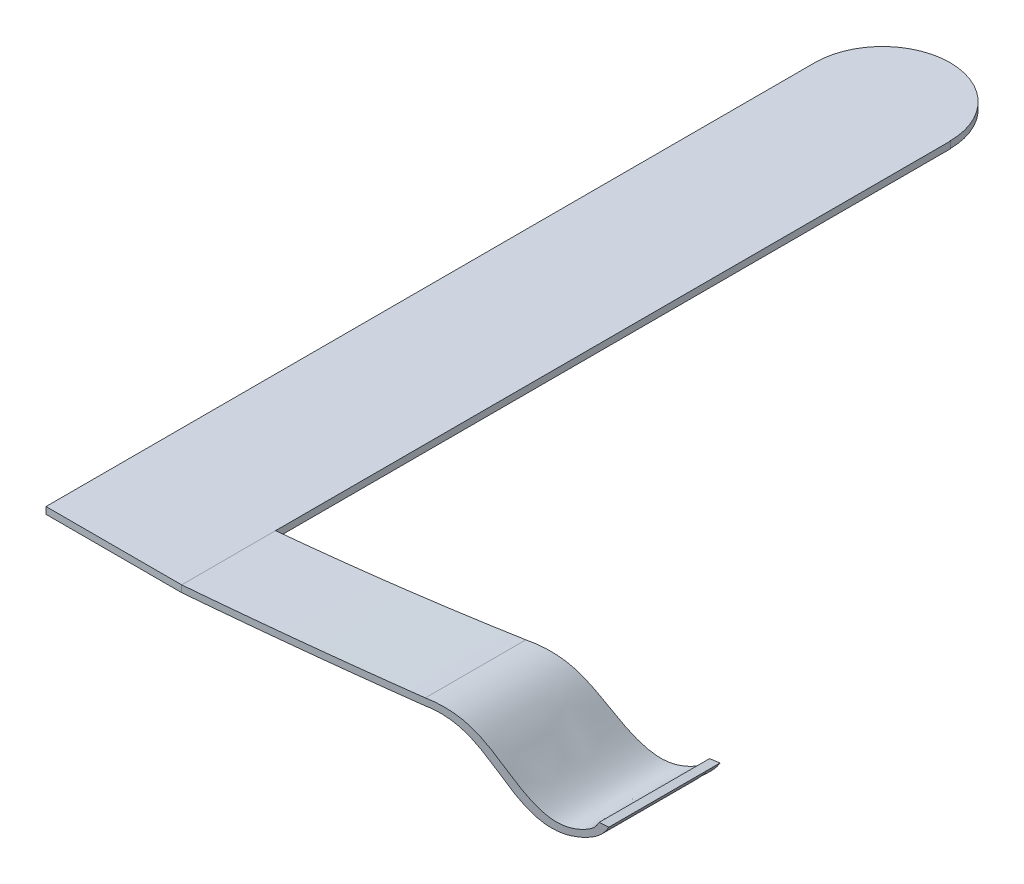
ISO-10303-21;
HEADER;
FILE_DESCRIPTION(('STEP AP214'),'2;1');
FILE_NAME('part.step','',(''),(''),'','','');
FILE_SCHEMA(('AUTOMOTIVE_DESIGN { 1 0 10303 214 1 1 1 1 }'));
ENDSEC;
DATA;
#1=APPLICATION_CONTEXT('core data for automotive mechanical design processes');
#2=APPLICATION_PROTOCOL_DEFINITION('international standard','automotive_design',2000,#1);
#3=PRODUCT_CONTEXT('',#1,'mechanical');
#4=PRODUCT('Part','Part','',(#3));
#5=PRODUCT_RELATED_PRODUCT_CATEGORY('part','',(#4));
#6=PRODUCT_DEFINITION_FORMATION('','',#4);
#7=PRODUCT_DEFINITION_CONTEXT('part definition',#1,'design');
#8=PRODUCT_DEFINITION('design','',#6,#7);
#9=PRODUCT_DEFINITION_SHAPE('','',#8);
#10=(LENGTH_UNIT() NAMED_UNIT(*) SI_UNIT(.MILLI.,.METRE.));
#11=(NAMED_UNIT(*) PLANE_ANGLE_UNIT() SI_UNIT($,.RADIAN.));
#12=(NAMED_UNIT(*) SI_UNIT($,.STERADIAN.) SOLID_ANGLE_UNIT());
#13=UNCERTAINTY_MEASURE_WITH_UNIT(LENGTH_MEASURE(1.E-05),#10,'distance_accuracy_value','');
#14=(GEOMETRIC_REPRESENTATION_CONTEXT(3) GLOBAL_UNCERTAINTY_ASSIGNED_CONTEXT((#13)) GLOBAL_UNIT_ASSIGNED_CONTEXT((#10,
#11,#12)) REPRESENTATION_CONTEXT('',''));
#15=CARTESIAN_POINT('',(0.,0.,0.));
#16=DIRECTION('',(0.,0.,1.));
#17=DIRECTION('',(1.,0.,0.));
#18=AXIS2_PLACEMENT_3D('',#15,#16,#17);
#19=CARTESIAN_POINT('',(0.00353824485749026,30.6,17.));
#20=DIRECTION('',(0.,-1.,0.));
#21=DIRECTION('',(0.,0.,-1.));
#22=AXIS2_PLACEMENT_3D('',#19,#20,#21);
#23=PLANE('',#22);
#24=DIRECTION('',(-1.,0.,0.));
#25=VECTOR('',#24,1.);
#26=CARTESIAN_POINT('',(1.50353824485749,30.6,17.));
#27=LINE('',#26,#25);
#28=CARTESIAN_POINT('',(1.5035388442671,30.5999999999988,17.));
#29=VERTEX_POINT('',#28);
#30=CARTESIAN_POINT('',(-1.49646175514251,30.6,17.));
#31=VERTEX_POINT('',#30);
#32=EDGE_CURVE('E296',#29,#31,#27,.T.);
#33=ORIENTED_EDGE('',*,*,#32,.F.);
#34=DIRECTION('',(0.,0.,1.));
#35=VECTOR('',#34,1.);
#36=CARTESIAN_POINT('',(1.5035388442671,30.5999999999988,-3.));
#37=LINE('',#36,#35);
#38=CARTESIAN_POINT('',(1.5035388442671,30.5999999999988,14.9244554655699));
#39=VERTEX_POINT('',#38);
#40=EDGE_CURVE('E323',#39,#29,#37,.T.);
#41=ORIENTED_EDGE('',*,*,#40,.F.);
#42=DIRECTION('',(0.,0.,-1.));
#43=VECTOR('',#42,1.);
#44=CARTESIAN_POINT('',(1.50353824485749,30.6,17.));
#45=LINE('',#44,#43);
#46=CARTESIAN_POINT('',(1.50353824485749,30.6,0.));
#47=VERTEX_POINT('',#46);
#48=EDGE_CURVE('E305',#39,#47,#45,.T.);
#49=ORIENTED_EDGE('',*,*,#48,.T.);
#50=DIRECTION('',(-1.,0.,0.));
#51=VECTOR('',#50,1.);
#52=CARTESIAN_POINT('',(0.00353824485749026,30.6,0.));
#53=LINE('',#52,#51);
#54=CARTESIAN_POINT('',(1.49646175514251,30.6,0.));
#55=VERTEX_POINT('',#54);
#56=EDGE_CURVE('E152',#47,#55,#53,.T.);
#57=ORIENTED_EDGE('',*,*,#56,.T.);
#58=CARTESIAN_POINT('',(0.,30.6,0.));
#59=DIRECTION('',(0.,1.,0.));
#60=DIRECTION('',(0.,0.,1.));
#61=AXIS2_PLACEMENT_3D('',#58,#59,#60);
#62=CIRCLE('',#61,1.49646175514251);
#63=CARTESIAN_POINT('',(-1.49646175514251,30.6,0.));
#64=VERTEX_POINT('',#63);
#65=EDGE_CURVE('E141',#55,#64,#62,.T.);
#66=ORIENTED_EDGE('',*,*,#65,.T.);
#67=DIRECTION('',(0.,0.,-1.));
#68=VECTOR('',#67,1.);
#69=CARTESIAN_POINT('',(-1.49646175514251,30.6,17.));
#70=LINE('',#69,#68);
#71=EDGE_CURVE('E150',#31,#64,#70,.T.);
#72=ORIENTED_EDGE('',*,*,#71,.F.);
#73=EDGE_LOOP('',(#33,#41,#49,#57,#66,#72));
#74=FACE_BOUND('',#73,.T.);
#75=ADVANCED_FACE('F36',(#74),#23,.F.);
#76=CARTESIAN_POINT('',(-1.49646175514251,30.6,17.));
#77=DIRECTION('',(1.,0.,0.));
#78=DIRECTION('',(0.,0.,-1.));
#79=AXIS2_PLACEMENT_3D('',#76,#77,#78);
#80=PLANE('',#79);
#81=DIRECTION('',(0.,-1.,0.));
#82=VECTOR('',#81,1.);
#83=CARTESIAN_POINT('',(-1.49646175514251,30.6,0.));
#84=LINE('',#83,#82);
#85=CARTESIAN_POINT('',(-1.49646175514251,30.45,0.));
#86=VERTEX_POINT('',#85);
#87=EDGE_CURVE('E134',#64,#86,#84,.T.);
#88=ORIENTED_EDGE('',*,*,#87,.T.);
#89=DIRECTION('',(0.,0.,-1.));
#90=VECTOR('',#89,1.);
#91=CARTESIAN_POINT('',(-1.49646175514251,30.45,17.));
#92=LINE('',#91,#90);
#93=CARTESIAN_POINT('',(-1.49646175514251,30.45,17.));
#94=VERTEX_POINT('',#93);
#95=EDGE_CURVE('E147',#94,#86,#92,.T.);
#96=ORIENTED_EDGE('',*,*,#95,.F.);
#97=DIRECTION('',(0.,-1.,0.));
#98=VECTOR('',#97,1.);
#99=CARTESIAN_POINT('',(-1.49646175514251,30.6,17.));
#100=LINE('',#99,#98);
#101=EDGE_CURVE('E298',#31,#94,#100,.T.);
#102=ORIENTED_EDGE('',*,*,#101,.F.);
#103=ORIENTED_EDGE('',*,*,#71,.T.);
#104=EDGE_LOOP('',(#88,#96,#102,#103));
#105=FACE_BOUND('',#104,.T.);
#106=ADVANCED_FACE('F145',(#105),#80,.F.);
#107=CARTESIAN_POINT('',(-1.49646175514251,30.45,17.));
#108=DIRECTION('',(0.,1.,0.));
#109=DIRECTION('',(0.,0.,1.));
#110=AXIS2_PLACEMENT_3D('',#107,#108,#109);
#111=PLANE('',#110);
#112=ORIENTED_EDGE('',*,*,#95,.T.);
#113=CARTESIAN_POINT('',(0.,30.45,0.));
#114=DIRECTION('',(0.,1.,0.));
#115=DIRECTION('',(0.,0.,1.));
#116=AXIS2_PLACEMENT_3D('',#113,#114,#115);
#117=CIRCLE('',#116,1.49646175514251);
#118=CARTESIAN_POINT('',(1.49646175514251,30.45,0.));
#119=VERTEX_POINT('',#118);
#120=EDGE_CURVE('E131',#119,#86,#117,.T.);
#121=ORIENTED_EDGE('',*,*,#120,.F.);
#122=DIRECTION('',(1.,0.,0.));
#123=VECTOR('',#122,1.);
#124=CARTESIAN_POINT('',(-1.49646175514251,30.45,0.));
#125=LINE('',#124,#123);
#126=CARTESIAN_POINT('',(1.50353824485749,30.45,0.));
#127=VERTEX_POINT('',#126);
#128=EDGE_CURVE('E151',#119,#127,#125,.T.);
#129=ORIENTED_EDGE('',*,*,#128,.T.);
#130=DIRECTION('',(0.,0.,-1.));
#131=VECTOR('',#130,1.);
#132=CARTESIAN_POINT('',(1.50353824485749,30.45,17.));
#133=LINE('',#132,#131);
#134=CARTESIAN_POINT('',(1.50353824485749,30.45,14.9244555259564));
#135=VERTEX_POINT('',#134);
#136=EDGE_CURVE('E162',#135,#127,#133,.T.);
#137=ORIENTED_EDGE('',*,*,#136,.F.);
#138=CARTESIAN_POINT('',(1.50353824485749,30.45,17.));
#139=VERTEX_POINT('',#138);
#140=EDGE_CURVE('E158',#139,#135,#133,.T.);
#141=ORIENTED_EDGE('',*,*,#140,.F.);
#142=DIRECTION('',(1.,0.,0.));
#143=VECTOR('',#142,1.);
#144=CARTESIAN_POINT('',(-1.49646175514251,30.45,17.));
#145=LINE('',#144,#143);
#146=EDGE_CURVE('E157',#94,#139,#145,.T.);
#147=ORIENTED_EDGE('',*,*,#146,.F.);
#148=EDGE_LOOP('',(#112,#121,#129,#137,#141,#147));
#149=FACE_BOUND('',#148,.T.);
#150=ADVANCED_FACE('F154',(#149),#111,.F.);
#151=CARTESIAN_POINT('',(1.50353824485749,30.45,17.));
#152=DIRECTION('',(-1.,0.,0.));
#153=DIRECTION('',(0.,0.,1.));
#154=AXIS2_PLACEMENT_3D('',#151,#152,#153);
#155=PLANE('',#154);
#156=ORIENTED_EDGE('',*,*,#48,.F.);
#157=DIRECTION('',(0.,-1.,0.));
#158=VECTOR('',#157,1.);
#159=CARTESIAN_POINT('',(1.50353824485749,30.6,14.9244555259564));
#160=LINE('',#159,#158);
#161=EDGE_CURVE('E293',#39,#135,#160,.T.);
#162=ORIENTED_EDGE('',*,*,#161,.T.);
#163=ORIENTED_EDGE('',*,*,#136,.T.);
#164=DIRECTION('',(0.,1.,0.));
#165=VECTOR('',#164,1.);
#166=CARTESIAN_POINT('',(1.50353824485749,30.45,0.));
#167=LINE('',#166,#165);
#168=EDGE_CURVE('E299',#127,#47,#167,.T.);
#169=ORIENTED_EDGE('',*,*,#168,.T.);
#170=EDGE_LOOP('',(#156,#162,#163,#169));
#171=FACE_BOUND('',#170,.T.);
#172=ADVANCED_FACE('F318',(#171),#155,.F.);
#173=CARTESIAN_POINT('',(0.,0.,17.));
#174=DIRECTION('',(0.,0.,1.));
#175=DIRECTION('',(1.,0.,0.));
#176=AXIS2_PLACEMENT_3D('',#173,#174,#175);
#177=PLANE('',#176);
#178=ORIENTED_EDGE('',*,*,#32,.T.);
#179=ORIENTED_EDGE('',*,*,#101,.T.);
#180=ORIENTED_EDGE('',*,*,#146,.T.);
#181=DIRECTION('',(0.,1.,0.));
#182=VECTOR('',#181,1.);
#183=CARTESIAN_POINT('',(1.50353824485749,30.45,17.));
#184=LINE('',#183,#182);
#185=EDGE_CURVE('E302',#139,#29,#184,.T.);
#186=ORIENTED_EDGE('',*,*,#185,.T.);
#187=EDGE_LOOP('',(#178,#179,#180,#186));
#188=FACE_BOUND('',#187,.T.);
#189=ADVANCED_FACE('F266',(#188),#177,.T.);
#190=CARTESIAN_POINT('',(0.,0.,0.));
#191=DIRECTION('',(0.,0.,1.));
#192=DIRECTION('',(1.,0.,0.));
#193=AXIS2_PLACEMENT_3D('',#190,#191,#192);
#194=PLANE('',#193);
#195=ORIENTED_EDGE('',*,*,#128,.F.);
#196=DIRECTION('',(0.,1.,0.));
#197=VECTOR('',#196,1.);
#198=CARTESIAN_POINT('',(1.49646175514251,30.45,0.));
#199=LINE('',#198,#197);
#200=EDGE_CURVE('E137',#119,#55,#199,.T.);
#201=ORIENTED_EDGE('',*,*,#200,.T.);
#202=ORIENTED_EDGE('',*,*,#56,.F.);
#203=ORIENTED_EDGE('',*,*,#168,.F.);
#204=EDGE_LOOP('',(#195,#201,#202,#203));
#205=FACE_BOUND('',#204,.T.);
#206=ADVANCED_FACE('F264',(#205),#194,.F.);
#207=CARTESIAN_POINT('',(0.,30.6,0.));
#208=DIRECTION('',(0.,-1.,0.));
#209=DIRECTION('',(0.,0.,-1.));
#210=AXIS2_PLACEMENT_3D('',#207,#208,#209);
#211=CYLINDRICAL_SURFACE('',#210,17.0663595196442);
#212=ORIENTED_EDGE('',*,*,#185,.F.);
#213=CARTESIAN_POINT('',(1.50353824485749,30.45,17.));
#214=CARTESIAN_POINT('',(1.68822974451204,30.4500039668715,16.98366812957));
#215=CARTESIAN_POINT('',(1.87264239920038,30.4476136351388,16.9643216783802));
#216=CARTESIAN_POINT('',(2.24063004913441,30.4380848180046,16.9196494404007));
#217=CARTESIAN_POINT('',(2.42420499474681,30.4309460548493,16.8943233038922));
#218=CARTESIAN_POINT('',(2.88587190987279,30.4069990661434,16.8229563805725));
#219=CARTESIAN_POINT('',(3.16321273164494,30.3870870383214,16.7730075168682));
#220=CARTESIAN_POINT('',(3.71420726952608,30.3366653497662,16.6596651725587));
#221=CARTESIAN_POINT('',(3.98786010199984,30.3061531945599,16.5962685287258));
#222=CARTESIAN_POINT('',(4.53461598958499,30.2344553771636,16.4553566590931));
#223=CARTESIAN_POINT('',(4.80764664330801,30.1931136288903,16.3776403545203));
#224=CARTESIAN_POINT('',(5.34791166757845,30.1006600879738,16.2092764117546));
#225=CARTESIAN_POINT('',(5.61514790172093,30.0495514900308,16.1186330044222));
#226=CARTESIAN_POINT('',(5.87910006647267,29.9938814388808,16.0217605044561));
#227=B_SPLINE_CURVE_WITH_KNOTS('',3,(#213,#214,#215,#216,#217,#218,#219,#220,#221,#222,#223,
#224,#225,#226),.UNSPECIFIED.,.F.,.F.,(4,2,2,2,2,2,4),(0.,0.556172772404506,1.11237808033915,
1.95931027013703,2.80644189925514,3.66652803374528,4.52633331730616),.UNSPECIFIED.);
#228=CARTESIAN_POINT('',(5.87910006647267,29.9938814388808,16.0217605044561));
#229=VERTEX_POINT('',#228);
#230=EDGE_CURVE('E281',#139,#229,#227,.T.);
#231=ORIENTED_EDGE('',*,*,#230,.T.);
#232=CARTESIAN_POINT('',(5.87910006647267,29.9938814388808,16.0217605044561));
#233=CARTESIAN_POINT('',(5.91323114055558,29.9894586919252,16.0092376166556));
#234=CARTESIAN_POINT('',(5.94717172147394,29.9836126949786,15.996658265575));
#235=CARTESIAN_POINT('',(6.01441881864245,29.9689813517303,15.9714955873555));
#236=CARTESIAN_POINT('',(6.04772518849224,29.9601953352478,15.9589122599643));
#237=CARTESIAN_POINT('',(6.11305553933172,29.9397120045094,15.9340010782126));
#238=CARTESIAN_POINT('',(6.14508988817875,29.9280494842928,15.9216719517461));
#239=CARTESIAN_POINT('',(6.20802701831235,29.9018274525662,15.8972377044968));
#240=CARTESIAN_POINT('',(6.23893006213451,29.8872686182984,15.8851325320689));
#241=CARTESIAN_POINT('',(6.2997264106735,29.8552683675535,15.8611208373726));
#242=CARTESIAN_POINT('',(6.32960658974609,29.8377996800138,15.8492174953272));
#243=CARTESIAN_POINT('',(6.38792781296583,29.8003661387717,15.8258014901629));
#244=CARTESIAN_POINT('',(6.41636825183317,29.7804002472654,15.8142889920173));
#245=CARTESIAN_POINT('',(6.49954681424749,29.7172177042852,15.7803712452834));
#246=CARTESIAN_POINT('',(6.55208879548047,29.6707453174196,15.7586069239808));
#247=CARTESIAN_POINT('',(6.63422450144673,29.5895362857381,15.7241505892769));
#248=CARTESIAN_POINT('',(6.6653502217644,29.5564798096249,15.7109776581865));
#249=CARTESIAN_POINT('',(6.72582417216138,29.4885643426081,15.6851838487002));
#250=CARTESIAN_POINT('',(6.75517221502784,29.4537051625702,15.6725630284876));
#251=CARTESIAN_POINT('',(6.84119369859012,29.3470575596067,15.6353011586714));
#252=CARTESIAN_POINT('',(6.89571602665537,29.273333419739,15.6113148477092));
#253=CARTESIAN_POINT('',(7.00253703885361,29.1237655719813,15.5636922998042));
#254=CARTESIAN_POINT('',(7.05482529337669,29.0479141907292,15.5400579827563));
#255=CARTESIAN_POINT('',(7.15988507153852,28.8968121556332,15.4919338684862));
#256=CARTESIAN_POINT('',(7.21265648642101,28.8215613734055,15.4674442604532));
#257=CARTESIAN_POINT('',(7.31492314730867,28.6829955726034,15.4193165276066));
#258=CARTESIAN_POINT('',(7.36405312886061,28.6193308938693,15.3959280701416));
#259=CARTESIAN_POINT('',(7.46690933405348,28.4968985638885,15.3463077207739));
#260=CARTESIAN_POINT('',(7.52063196877506,28.4381271584333,15.3200780449306));
#261=CARTESIAN_POINT('',(7.62192592529253,28.3418813542097,15.2698820827123));
#262=CARTESIAN_POINT('',(7.66814758227328,28.3025944582953,15.2467418208406));
#263=CARTESIAN_POINT('',(7.7651540836258,28.232614508725,15.1975632138027));
#264=CARTESIAN_POINT('',(7.81591262198168,28.2018756828376,15.171541390146));
#265=CARTESIAN_POINT('',(7.88788895527218,28.1680664066544,15.1341436998642));
#266=CARTESIAN_POINT('',(7.90736206998787,28.1598329173247,15.1239792378096));
#267=CARTESIAN_POINT('',(7.94676800561019,28.1450642870581,15.1033108915008));
#268=CARTESIAN_POINT('',(7.96670072494546,28.1385287747163,15.0928070820394));
#269=CARTESIAN_POINT('',(8.00715781290207,28.1272006383101,15.0713828205013));
#270=CARTESIAN_POINT('',(8.02768639319729,28.122429579353,15.060458906698));
#271=CARTESIAN_POINT('',(8.06898669865705,28.1147809054727,15.0383720406265));
#272=CARTESIAN_POINT('',(8.0897585959236,28.111904724875,15.0272089138705));
#273=CARTESIAN_POINT('',(8.11057713146547,28.11,15.0159637002858));
#274=B_SPLINE_CURVE_WITH_KNOTS('',3,(#232,#233,#234,#235,#236,#237,#238,#239,#240,#241,#242,
#243,#244,#245,#246,#247,#248,#249,#250,#251,#252,#253,#254,#255,#256,#257,#258,#259,#260,#261,
#262,#263,#264,#265,#266,#267,#268,#269,#270,#271,#272,#273),.UNSPECIFIED.,.F.,.F.,(4,2,2,2,2,2,
2,2,2,2,2,2,2,2,2,2,2,2,2,2,4),(0.,0.109864738679766,0.219754538232763,0.328375235040353,
0.436970562967198,0.546647701555483,0.656370572866329,0.876007545349609,1.01778017975357,
1.1595677188166,1.44372123020966,1.72908179268055,2.01437962863422,2.26548745629332,
2.51640081925497,2.71066420283717,2.90386640731285,2.97418667405305,3.04449154639705,
3.11562931468752,3.18682086893149),.UNSPECIFIED.);
#275=CARTESIAN_POINT('',(8.1105771314799,28.11,15.0159637002779));
#276=VERTEX_POINT('',#275);
#277=EDGE_CURVE('E241',#229,#276,#274,.T.);
#278=ORIENTED_EDGE('',*,*,#277,.T.);
#279=CARTESIAN_POINT('',(0.,28.11,0.));
#280=DIRECTION('',(0.,1.,0.));
#281=DIRECTION('',(0.,0.,1.));
#282=AXIS2_PLACEMENT_3D('',#279,#280,#281);
#283=CIRCLE('',#282,17.0663595196442);
#284=CARTESIAN_POINT('',(8.23891239219343,28.11,14.9459342246482));
#285=VERTEX_POINT('',#284);
#286=EDGE_CURVE('E287',#276,#285,#283,.T.);
#287=ORIENTED_EDGE('',*,*,#286,.T.);
#288=CARTESIAN_POINT('',(8.23891239220167,28.11,14.9459342246437));
#289=CARTESIAN_POINT('',(8.25913524529287,28.1118339453389,14.934786999038));
#290=CARTESIAN_POINT('',(8.27929495730358,28.1144553503247,14.9236199271016));
#291=CARTESIAN_POINT('',(8.31943537310482,28.1214685001042,14.9012800794827));
#292=CARTESIAN_POINT('',(8.33941464610469,28.1258691759318,14.8901075633382));
#293=CARTESIAN_POINT('',(8.37918547988215,28.1366900889781,14.8677639827306));
#294=CARTESIAN_POINT('',(8.39897136966234,28.1431354416003,14.8565947652477));
#295=CARTESIAN_POINT('',(8.43778845795454,28.1583628638801,14.8345828391142));
#296=CARTESIAN_POINT('',(8.45682106922755,28.167140295395,14.8237395294162));
#297=CARTESIAN_POINT('',(8.48538597379033,28.1829133431134,14.8073964456657));
#298=CARTESIAN_POINT('',(8.49533923087312,28.1889332857676,14.8016878944932));
#299=CARTESIAN_POINT('',(8.51476540259117,28.2019081608585,14.7905213737364));
#300=CARTESIAN_POINT('',(8.5242385140198,28.2088627058994,14.7850633015786));
#301=CARTESIAN_POINT('',(8.54248429756015,28.2237476398431,14.774528737118));
#302=CARTESIAN_POINT('',(8.55126157853918,28.2316705335534,14.7694497498838));
#303=CARTESIAN_POINT('',(8.56802038611188,28.2485564765028,14.7597340187716));
#304=CARTESIAN_POINT('',(8.57600205417466,28.2575193402077,14.7550971962779));
#305=CARTESIAN_POINT('',(8.59097150969852,28.2759972914412,14.7463862874275));
#306=CARTESIAN_POINT('',(8.59798132810547,28.2854889856902,14.7422998250152));
#307=CARTESIAN_POINT('',(8.61134148133633,28.3050828977435,14.734499822459));
#308=CARTESIAN_POINT('',(8.6176910904319,28.315185768485,14.7307866928423));
#309=CARTESIAN_POINT('',(8.62991102127479,28.3359811086178,14.7236311495084));
#310=CARTESIAN_POINT('',(8.63577296805354,28.3466800431931,14.7201934933612));
#311=CARTESIAN_POINT('',(8.64701723602024,28.3683650645749,14.7135910371284));
#312=CARTESIAN_POINT('',(8.6524010043717,28.3793501450877,14.7104254147726));
#313=CARTESIAN_POINT('',(8.65761609193715,28.3904303279046,14.7073556718528));
#314=B_SPLINE_CURVE_WITH_KNOTS('',3,(#288,#289,#290,#291,#292,#293,#294,#295,#296,#297,#298,
#299,#300,#301,#302,#303,#304,#305,#306,#307,#308,#309,#310,#311,#312,#313),.UNSPECIFIED.,.F.,
.F.,(4,2,2,2,2,2,2,2,2,2,2,2,4),(0.,0.0695049424437861,0.139363183514444,0.210115098088556,
0.280727337963355,0.319563370950169,0.358383355635296,0.396919921117938,0.435449622087154,
0.472867682490326,0.510326448883609,0.54833345915316,0.586221218764988),.UNSPECIFIED.);
#315=CARTESIAN_POINT('',(8.65761609193715,28.3904303279046,14.7073556718528));
#316=VERTEX_POINT('',#315);
#317=EDGE_CURVE('E63',#285,#316,#314,.T.);
#318=ORIENTED_EDGE('',*,*,#317,.T.);
#319=CARTESIAN_POINT('',(0.,32.4642387533771,0.));
#320=DIRECTION('',(-0.425765903184976,-0.904833352438493,0.));
#321=DIRECTION('',(0.904833352438493,-0.425765903184976,0.));
#322=AXIS2_PLACEMENT_3D('',#319,#320,#321);
#323=ELLIPSE('',#322,18.8613289658819,17.0663595196442);
#324=CARTESIAN_POINT('',(8.52189108907138,28.4542952133824,14.7864126656791));
#325=VERTEX_POINT('',#324);
#326=EDGE_CURVE('E279',#316,#325,#323,.T.);
#327=ORIENTED_EDGE('',*,*,#326,.T.);
#328=CARTESIAN_POINT('',(8.52189108907138,28.4542952133824,14.7864126656791));
#329=CARTESIAN_POINT('',(8.51815470426833,28.4463902265474,14.7885660578007));
#330=CARTESIAN_POINT('',(8.51427971317899,28.4385713964501,14.790797463199));
#331=CARTESIAN_POINT('',(8.50623640058212,28.4230892813711,14.7954246720633));
#332=CARTESIAN_POINT('',(8.50206686753934,28.4154268286159,14.7978211533917));
#333=CARTESIAN_POINT('',(8.49347968042145,28.4003604003026,14.8027515868762));
#334=CARTESIAN_POINT('',(8.48906385349689,28.3929550484641,14.8052845229124));
#335=CARTESIAN_POINT('',(8.47987188842872,28.378450218688,14.8105512545951));
#336=CARTESIAN_POINT('',(8.47509623561904,28.3713503483383,14.8132847795614));
#337=CARTESIAN_POINT('',(8.46604323480905,28.359361467267,14.8184600962754));
#338=CARTESIAN_POINT('',(8.46190347558986,28.3543392731774,14.8208246294589));
#339=CARTESIAN_POINT('',(8.45311707122835,28.3449265487915,14.8258377276508));
#340=CARTESIAN_POINT('',(8.44847113053757,28.3405351598619,14.8284858978373));
#341=CARTESIAN_POINT('',(8.43879523518546,28.3324022762341,14.8339945060191));
#342=CARTESIAN_POINT('',(8.43376648298285,28.3286588583565,14.8368542786118));
#343=CARTESIAN_POINT('',(8.42346968243066,28.321611335338,14.842702623063));
#344=CARTESIAN_POINT('',(8.41820114376337,28.3183081900913,14.8456914581264));
#345=CARTESIAN_POINT('',(8.40254768367868,28.3091573520501,14.8545602201192));
#346=CARTESIAN_POINT('',(8.3919463331722,28.3037886208257,14.8605523380262));
#347=CARTESIAN_POINT('',(8.3703923397329,28.2940273923472,14.8727036430196));
#348=CARTESIAN_POINT('',(8.35943924568432,28.2896362111065,14.8788630429479));
#349=CARTESIAN_POINT('',(8.32600062763599,28.2776606505043,14.8976171014424));
#350=CARTESIAN_POINT('',(8.30312605288704,28.2713762866098,14.9103797143952));
#351=CARTESIAN_POINT('',(8.26267500590819,28.2633911143031,14.9328236606318));
#352=CARTESIAN_POINT('',(8.2452185055658,28.2609337732609,14.9424696726559));
#353=CARTESIAN_POINT('',(8.21014539455422,28.257727886712,14.9617692898956));
#354=CARTESIAN_POINT('',(8.19252871991689,28.2569800569941,14.9714228965994));
#355=CARTESIAN_POINT('',(8.15738666891415,28.2570900996924,14.9905993283403));
#356=CARTESIAN_POINT('',(8.13986147821575,28.2579371756396,15.0001225963086));
#357=CARTESIAN_POINT('',(8.10489808620797,28.261207976181,15.0190428769252));
#358=CARTESIAN_POINT('',(8.08745984533148,28.2636309019186,15.0284399510837));
#359=CARTESIAN_POINT('',(8.05274437445333,28.2702383951607,15.0470702983257));
#360=CARTESIAN_POINT('',(8.03546791557956,28.2744290615247,15.0563028878828));
#361=CARTESIAN_POINT('',(8.00130357657023,28.2846025274499,15.0744864997774));
#362=CARTESIAN_POINT('',(7.9844156827905,28.2905852639801,15.0834375320055));
#363=CARTESIAN_POINT('',(7.93441318213506,28.3110271899687,15.1098357858386));
#364=CARTESIAN_POINT('',(7.90204097428598,28.3279638926626,15.1267846356778));
#365=CARTESIAN_POINT('',(7.8440775056256,28.3635556931964,15.1569120869559));
#366=CARTESIAN_POINT('',(7.81818732526997,28.3815962666323,15.1702793980811));
#367=CARTESIAN_POINT('',(7.76779436347813,28.4201084213803,15.196144227552));
#368=CARTESIAN_POINT('',(7.7432926865605,28.4405818990018,15.2086410552124));
#369=CARTESIAN_POINT('',(7.6954549296017,28.4833588824242,15.2329026156606));
#370=CARTESIAN_POINT('',(7.67212188657791,28.5056667949221,15.2446654586814));
#371=CARTESIAN_POINT('',(7.62648408673215,28.5516278515154,15.2675479039892));
#372=CARTESIAN_POINT('',(7.60417961316614,28.5752813622142,15.2786673292987));
#373=CARTESIAN_POINT('',(7.55663305853326,28.6278063781158,15.3022464288313));
#374=CARTESIAN_POINT('',(7.5315538855029,28.6568704536329,15.3146033040038));
#375=CARTESIAN_POINT('',(7.48235146747103,28.7160315965262,15.3387024731593));
#376=CARTESIAN_POINT('',(7.45822814486119,28.7461285796659,15.3504448170629));
#377=CARTESIAN_POINT('',(7.41071088129898,28.8071272588659,15.3734410252621));
#378=CARTESIAN_POINT('',(7.38731773173746,28.838029765689,15.3846943644029));
#379=CARTESIAN_POINT('',(7.34112567592189,28.9004184023299,15.4067892602067));
#380=CARTESIAN_POINT('',(7.31832677425519,28.9319045366499,15.4176308136911));
#381=CARTESIAN_POINT('',(7.25032436957597,29.0270763385556,15.4497882596314));
#382=CARTESIAN_POINT('',(7.20565728571267,29.0912867959778,15.4706682612025));
#383=CARTESIAN_POINT('',(7.1159521878748,29.2194873421201,15.512133598949));
#384=CARTESIAN_POINT('',(7.07091440004779,29.2834775356599,15.5327190964314));
#385=CARTESIAN_POINT('',(6.98880631400266,29.3959458205323,15.5698031187701));
#386=CARTESIAN_POINT('',(6.95215096589849,29.4447522701783,15.5862094847475));
#387=CARTESIAN_POINT('',(6.87666415118081,29.5404983946281,15.619661460874));
#388=CARTESIAN_POINT('',(6.83783150126957,29.587437030171,15.6367074169234));
#389=CARTESIAN_POINT('',(6.75742019338407,29.6779999593534,15.6716243881942));
#390=CARTESIAN_POINT('',(6.71586232915843,29.7216448851483,15.6894888997665));
#391=CARTESIAN_POINT('',(6.62890499134819,29.8043307815295,15.7264257646145));
#392=CARTESIAN_POINT('',(6.5835108144625,29.8433779273758,15.7454964436941));
#393=CARTESIAN_POINT('',(6.50390172210436,29.903663165865,15.7785010936961));
#394=CARTESIAN_POINT('',(6.47081751542871,29.9265775093122,15.7921023474511));
#395=CARTESIAN_POINT('',(6.40282553379928,29.9692167797171,15.8197913581657));
#396=CARTESIAN_POINT('',(6.36791721841183,29.9889407542856,15.8338792588815));
#397=CARTESIAN_POINT('',(6.29653698998711,30.0251789229547,15.8623998385452));
#398=CARTESIAN_POINT('',(6.26006267729029,30.0416879596052,15.8768330304446));
#399=CARTESIAN_POINT('',(6.18591413820942,30.0715189400344,15.9058693424261));
#400=CARTESIAN_POINT('',(6.14824026462688,30.0848418112588,15.9204724117583));
#401=CARTESIAN_POINT('',(6.07641586560338,30.1067885499749,15.9480122606827));
#402=CARTESIAN_POINT('',(6.04237567354151,30.1157818298623,15.9609418259433));
#403=CARTESIAN_POINT('',(5.97377965277677,30.1309535706276,15.9867422867094));
#404=CARTESIAN_POINT('',(5.93922574593126,30.1371406568059,15.9996132399483));
#405=CARTESIAN_POINT('',(5.90443650688504,30.1418363566235,16.0124406880997));
#406=B_SPLINE_CURVE_WITH_KNOTS('',3,(#328,#329,#330,#331,#332,#333,#334,#335,#336,#337,#338,
#339,#340,#341,#342,#343,#344,#345,#346,#347,#348,#349,#350,#351,#352,#353,#354,#355,#356,#357,
#358,#359,#360,#361,#362,#363,#364,#365,#366,#367,#368,#369,#370,#371,#372,#373,#374,#375,#376,
#377,#378,#379,#380,#381,#382,#383,#384,#385,#386,#387,#388,#389,#390,#391,#392,#393,#394,#395,
#396,#397,#398,#399,#400,#401,#402,#403,#404,#405),.UNSPECIFIED.,.F.,.F.,(4,2,2,2,2,2,2,2,2,2,2,
2,2,2,2,2,2,2,2,2,2,2,2,2,2,2,2,2,2,2,2,2,2,2,2,2,2,2,4),(0.,0.0270135091705565,
0.0541454507634215,0.0810976123613133,0.108014050098448,0.128746576252232,0.149450608917628,
0.17009209713157,0.190777876970613,0.230635147436493,0.270545755012599,0.351085393362595,
0.411297203416047,0.471534220120296,0.531364936996391,0.591165347089471,0.651173783392306,
0.711180109318615,0.831469248683537,0.934149000508964,1.03690931684338,1.13992413081159,
1.24296714647744,1.36391316234275,1.48484933803603,1.6059123330081,1.72697626226079,
1.9698415376103,2.21256826169983,2.40214251929641,2.59182082268341,2.78019049196945,
2.96830420501186,3.09559833810284,3.22293040120013,3.35046507927921,3.47796258858529,
3.59037941950037,3.70244833733163),.UNSPECIFIED.);
#407=CARTESIAN_POINT('',(5.90443650688504,30.1418363566235,16.0124406880997));
#408=VERTEX_POINT('',#407);
#409=EDGE_CURVE('E273',#325,#408,#406,.T.);
#410=ORIENTED_EDGE('',*,*,#409,.T.);
#411=CARTESIAN_POINT('',(5.90443650688504,30.1418363566235,16.0124406880997));
#412=CARTESIAN_POINT('',(5.73206665489706,30.1781262845885,16.0759999117848));
#413=CARTESIAN_POINT('',(5.55832973517596,30.2124527616412,16.1369016256211));
#414=CARTESIAN_POINT('',(5.2082657146776,30.2770404044044,16.2532655774286));
#415=CARTESIAN_POINT('',(5.03193819407334,30.307300902947,16.3087269223124));
#416=CARTESIAN_POINT('',(4.4996624031733,30.3917126541126,16.4666472834317));
#417=CARTESIAN_POINT('',(4.14013754566303,30.439554166375,16.5607473347467));
#418=CARTESIAN_POINT('',(3.59124423456795,30.4982864931722,16.6853221631868));
#419=CARTESIAN_POINT('',(3.40446445880668,30.5158157386481,16.7244357255351));
#420=CARTESIAN_POINT('',(3.02933577514965,30.5460346889914,16.7964342448573));
#421=CARTESIAN_POINT('',(2.8409871376782,30.5587252109632,16.8293202529919));
#422=CARTESIAN_POINT('',(2.46166686336232,30.5792181500846,16.8889888891225));
#423=CARTESIAN_POINT('',(2.27068610611258,30.5869846488052,16.9157257821093));
#424=CARTESIAN_POINT('',(1.88774815979377,30.5973769528429,16.9627324692612));
#425=CARTESIAN_POINT('',(1.69579076131344,30.6000016046773,16.9830008114678));
#426=CARTESIAN_POINT('',(1.5035388442671,30.5999999999988,16.9999999469862));
#427=B_SPLINE_CURVE_WITH_KNOTS('',3,(#411,#412,#413,#414,#415,#416,#417,#418,#419,#420,#421,
#422,#423,#424,#425,#426),.UNSPECIFIED.,.F.,.F.,(4,2,2,2,2,2,2,4),(0.,0.561709306548005,
1.12351066915203,2.24619185724186,2.82096540041257,3.39564183982693,3.97446345148713,
4.55341489669951),.UNSPECIFIED.);
#428=EDGE_CURVE('E255',#408,#29,#427,.T.);
#429=ORIENTED_EDGE('',*,*,#428,.T.);
#430=EDGE_LOOP('',(#212,#231,#278,#287,#318,#327,#410,#429));
#431=FACE_BOUND('',#430,.T.);
#432=ADVANCED_FACE('F260',(#431),#211,.T.);
#433=CARTESIAN_POINT('',(0.,30.6,0.));
#434=DIRECTION('',(0.,-1.,0.));
#435=DIRECTION('',(0.,0.,-1.));
#436=AXIS2_PLACEMENT_3D('',#433,#434,#435);
#437=CYLINDRICAL_SURFACE('',#436,15.);
#438=CARTESIAN_POINT('',(8.11057713146547,28.11,12.6181828562812));
#439=CARTESIAN_POINT('',(8.08781761579789,28.1120791578922,12.6328128363868));
#440=CARTESIAN_POINT('',(8.06509435204579,28.1153250669086,12.6473307872047));
#441=CARTESIAN_POINT('',(8.0199060434919,28.124097303636,12.6760331735111));
#442=CARTESIAN_POINT('',(7.99744079581466,28.1296216926559,12.6902178817267));
#443=CARTESIAN_POINT('',(7.95322417090813,28.1428093011706,12.7179754267881));
#444=CARTESIAN_POINT('',(7.93146721260439,28.150441754606,12.7315540250692));
#445=CARTESIAN_POINT('',(7.8884753354236,28.1677401995592,12.7582364365565));
#446=CARTESIAN_POINT('',(7.86724053165158,28.1774066350431,12.7713401453734));
#447=CARTESIAN_POINT('',(7.81816016317549,28.2022564917083,12.8014633200877));
#448=CARTESIAN_POINT('',(7.79056479918933,28.2181922309743,12.8182718600683));
#449=CARTESIAN_POINT('',(7.73660667255229,28.252919429356,12.850910949057));
#450=CARTESIAN_POINT('',(7.71024497537347,28.2717132995076,12.8667406563411));
#451=CARTESIAN_POINT('',(7.63279403521424,28.3317802642296,12.9129428128172));
#452=CARTESIAN_POINT('',(7.58359527157687,28.3766000041726,12.9418716013389));
#453=CARTESIAN_POINT('',(7.49134672556547,28.4702216852235,12.9954784579565));
#454=CARTESIAN_POINT('',(7.4481323951748,28.518801536791,13.0202779321314));
#455=CARTESIAN_POINT('',(7.36450741250458,28.6193473395852,13.0677595935373));
#456=CARTESIAN_POINT('',(7.32409978337097,28.6713168285452,13.0904395065624));
#457=CARTESIAN_POINT('',(7.24495880371103,28.7773092218628,13.1344061917045));
#458=CARTESIAN_POINT('',(7.20623058674357,28.8313375873535,13.1556887822546));
#459=CARTESIAN_POINT('',(7.12952682671456,28.9402506942613,13.1974146286061));
#460=CARTESIAN_POINT('',(7.09155142053844,28.9951355882387,13.2178577324726));
#461=CARTESIAN_POINT('',(7.01612680211649,29.103682316204,13.2580448201169));
#462=CARTESIAN_POINT('',(6.9786830807447,29.157345838373,13.2777945002219));
#463=CARTESIAN_POINT('',(6.90246314776324,29.2636642766797,13.3175768901627));
#464=CARTESIAN_POINT('',(6.86368639408681,29.3163187686183,13.3376097131391));
#465=CARTESIAN_POINT('',(6.78381207663063,29.4191379678275,13.3784114271171));
#466=CARTESIAN_POINT('',(6.74272668376878,29.4693135140889,13.3991762759792));
#467=CARTESIAN_POINT('',(6.65708774899922,29.5660015359764,13.4419297586646));
#468=CARTESIAN_POINT('',(6.61253752488907,29.612517432126,13.4639172161474));
#469=CARTESIAN_POINT('',(6.50993194877577,29.708492822982,13.5138679301235));
#470=CARTESIAN_POINT('',(6.45092460244348,29.7568081672692,13.5421688923233));
#471=CARTESIAN_POINT('',(6.35735225872229,29.8206543360345,13.5862155986771));
#472=CARTESIAN_POINT('',(6.32532943513409,29.840493409471,13.6011584671099));
#473=CARTESIAN_POINT('',(6.25970880973756,29.8769504488423,13.6314839381779));
#474=CARTESIAN_POINT('',(6.22611149505633,29.893569402976,13.6468664042401));
#475=CARTESIAN_POINT('',(6.14210462350494,29.9300183740675,13.6849375644606));
#476=CARTESIAN_POINT('',(6.09092469085799,29.9479353179175,13.7078031654772));
#477=CARTESIAN_POINT('',(6.01259321085085,29.9692513730028,13.742254117175));
#478=CARTESIAN_POINT('',(5.98614137243306,29.9754402113996,13.7537977803695));
#479=CARTESIAN_POINT('',(5.93287091337417,29.9860027346693,13.7768605141735));
#480=CARTESIAN_POINT('',(5.90605234790626,29.99037668955,13.7883795881873));
#481=CARTESIAN_POINT('',(5.87910006647264,29.9938814388808,13.7998616807705));
#482=B_SPLINE_CURVE_WITH_KNOTS('',3,(#438,#439,#440,#441,#442,#443,#444,#445,#446,#447,#448,
#449,#450,#451,#452,#453,#454,#455,#456,#457,#458,#459,#460,#461,#462,#463,#464,#465,#466,#467,
#468,#469,#470,#471,#472,#473,#474,#475,#476,#477,#478,#479,#480,#481),.UNSPECIFIED.,.F.,.F.,(4,
2,2,2,2,2,2,2,2,2,2,2,2,2,2,2,2,2,2,2,2,4),(0.,0.0813807290151304,0.162692355968923,
0.24287485273534,0.32307486947859,0.430978169582102,0.538973003917591,0.755943084522607,
0.964491622874697,1.17326141654458,1.38262989165581,1.59203609387547,1.79708544922103,
2.00221919615508,2.20635782667883,2.41030333281338,2.65333191414716,2.77476531139833,
2.89616138361634,3.07211031194397,3.16061319675403,3.24910290989472),.UNSPECIFIED.);
#483=CARTESIAN_POINT('',(8.1105771314799,28.11,12.618182856272));
#484=VERTEX_POINT('',#483);
#485=CARTESIAN_POINT('',(5.87910006647267,29.9938814388808,13.7998616807706));
#486=VERTEX_POINT('',#485);
#487=EDGE_CURVE('E55',#484,#486,#482,.T.);
#488=ORIENTED_EDGE('',*,*,#487,.T.);
#489=CARTESIAN_POINT('',(5.87910006647267,29.9938814388808,13.7998616807706));
#490=CARTESIAN_POINT('',(5.70997818443105,30.0295357586988,13.8719105395129));
#491=CARTESIAN_POINT('',(5.53923697123697,30.0633919485546,13.9409777164212));
#492=CARTESIAN_POINT('',(5.19466502906881,30.1272790773392,14.0730071458018));
#493=CARTESIAN_POINT('',(5.02083366521785,30.1573092196031,14.135968126184));
#494=CARTESIAN_POINT('',(4.49537204643793,30.2412418724436,14.3153210754812));
#495=CARTESIAN_POINT('',(4.13944798218244,30.2890561463871,14.4223223380411));
#496=CARTESIAN_POINT('',(3.59403921430477,30.3479107828318,14.5643254373005));
#497=CARTESIAN_POINT('',(3.40770042566866,30.3655314758615,14.6090514991149));
#498=CARTESIAN_POINT('',(3.03308544620208,30.3958950911434,14.6913969166161));
#499=CARTESIAN_POINT('',(2.84480965601032,30.4086390020519,14.7290177119492));
#500=CARTESIAN_POINT('',(2.46505977578855,30.4292091535363,14.7973313560362));
#501=CARTESIAN_POINT('',(2.27357210641831,30.4369920268118,14.8279616461768));
#502=CARTESIAN_POINT('',(1.88936368785198,30.4473917259353,14.8818004800749));
#503=CARTESIAN_POINT('',(1.69664261530873,30.4500071363462,14.905006988901));
#504=CARTESIAN_POINT('',(1.50353824485749,30.45,14.9244555259564));
#505=B_SPLINE_CURVE_WITH_KNOTS('',3,(#489,#490,#491,#492,#493,#494,#495,#496,#497,#498,#499,
#500,#501,#502,#503,#504),.UNSPECIFIED.,.F.,.F.,(4,2,2,2,2,2,2,4),(0.,0.561667950594652,
1.12345266198394,2.24594085383311,2.82310242155928,3.40014692089634,3.98216891945288,
4.56435031951527),.UNSPECIFIED.);
#506=EDGE_CURVE('E11',#486,#135,#505,.T.);
#507=ORIENTED_EDGE('',*,*,#506,.T.);
#508=ORIENTED_EDGE('',*,*,#161,.F.);
#509=CARTESIAN_POINT('',(1.5035388442671,30.5999999999988,14.9244554655699));
#510=CARTESIAN_POINT('',(1.69004992962875,30.6000015886301,14.9056692689427));
#511=CARTESIAN_POINT('',(1.87619133751489,30.5975310574281,14.8833813010729));
#512=CARTESIAN_POINT('',(2.2473942768131,30.5877618616351,14.8318680110077));
#513=CARTESIAN_POINT('',(2.43245575455579,30.5804629591153,14.8026423469872));
#514=CARTESIAN_POINT('',(2.89834756809191,30.5560619014775,14.720099199647));
#515=CARTESIAN_POINT('',(3.17821911628028,30.535819869404,14.662204309512));
#516=CARTESIAN_POINT('',(3.73335954249243,30.4848543269509,14.5307756765618));
#517=CARTESIAN_POINT('',(4.00862702673826,30.4541277007528,14.4572372872504));
#518=CARTESIAN_POINT('',(4.5583449360682,30.3821288330076,14.2935369114688));
#519=CARTESIAN_POINT('',(4.8326878627804,30.3406735840398,14.203094878043));
#520=CARTESIAN_POINT('',(5.37418448214282,30.2482287462658,14.00718262538));
#521=CARTESIAN_POINT('',(5.64134109594222,30.1972431005499,13.9017186255853));
#522=CARTESIAN_POINT('',(5.90443650688504,30.1418363566235,13.7890401963358));
#523=B_SPLINE_CURVE_WITH_KNOTS('',3,(#509,#510,#511,#512,#513,#514,#515,#516,#517,#518,#519,
#520,#521,#522),.UNSPECIFIED.,.F.,.F.,(4,2,2,2,2,2,4),(0.,0.562283492703568,1.12459469526067,
1.98342523382023,2.8425112228169,3.71734700302431,4.59182162809959),.UNSPECIFIED.);
#524=CARTESIAN_POINT('',(5.90443650688504,30.1418363566235,13.7890401963358));
#525=VERTEX_POINT('',#524);
#526=EDGE_CURVE('E169',#39,#525,#523,.T.);
#527=ORIENTED_EDGE('',*,*,#526,.T.);
#528=CARTESIAN_POINT('',(5.90443650688504,30.1418363566235,13.7890401963358));
#529=CARTESIAN_POINT('',(5.93579444573008,30.1376084656864,13.7756133974289));
#530=CARTESIAN_POINT('',(5.96695740095376,30.1321636386107,13.7621423282698));
#531=CARTESIAN_POINT('',(6.0288107896389,30.1189989748411,13.7351583672565));
#532=CARTESIAN_POINT('',(6.05950085745984,30.1112774623883,13.7216454518763));
#533=CARTESIAN_POINT('',(6.12029505292048,30.0937204708767,13.6946375127207));
#534=CARTESIAN_POINT('',(6.15039886913769,30.0838838999781,13.6811425018222));
#535=CARTESIAN_POINT('',(6.20932502280036,30.0623886499201,13.6544977088351));
#536=CARTESIAN_POINT('',(6.23816089198214,30.050769039671,13.6413463097413));
#537=CARTESIAN_POINT('',(6.29503999666732,30.0256066067897,13.6151919057822));
#538=CARTESIAN_POINT('',(6.32308347656002,30.0120643850681,13.6021888559172));
#539=CARTESIAN_POINT('',(6.37822135045851,29.9830025187794,13.5764214046327));
#540=CARTESIAN_POINT('',(6.40531618865735,29.9674838159062,13.5636568928615));
#541=CARTESIAN_POINT('',(6.46648558094927,29.9294854392624,13.5346234758183));
#542=CARTESIAN_POINT('',(6.50018893291617,29.9063209614229,13.5184639668002));
#543=CARTESIAN_POINT('',(6.56566469614067,29.8570313585843,13.4867849479787));
#544=CARTESIAN_POINT('',(6.59743689496527,29.8309059087712,13.4712655086452));
#545=CARTESIAN_POINT('',(6.6901109606377,29.7486633159797,13.4256170915099));
#546=CARTESIAN_POINT('',(6.74817473250023,29.6888065973701,13.396491386721));
#547=CARTESIAN_POINT('',(6.86210082084849,29.5596396936474,13.3385121493823));
#548=CARTESIAN_POINT('',(6.91760678999343,29.4899742136543,13.309786071585));
#549=CARTESIAN_POINT('',(7.0250845787228,29.3474840860259,13.2533718245154));
#550=CARTESIAN_POINT('',(7.07705183177775,29.2746555478353,13.2256850162837));
#551=CARTESIAN_POINT('',(7.17985809977117,29.1283914959143,13.1701578228619));
#552=CARTESIAN_POINT('',(7.23069812555815,29.0549566143673,13.142317605745));
#553=CARTESIAN_POINT('',(7.30807657728861,28.9461187301069,13.099346333101));
#554=CARTESIAN_POINT('',(7.33404257965678,28.910076141668,13.0848282865613));
#555=CARTESIAN_POINT('',(7.38670009965572,28.8387844154511,13.0551742951618));
#556=CARTESIAN_POINT('',(7.41339156691503,28.8035352228941,13.0400383931655));
#557=CARTESIAN_POINT('',(7.47818888797719,28.7207589159361,13.0030217024032));
#558=CARTESIAN_POINT('',(7.51673349530229,28.6737287064328,12.9807873518029));
#559=CARTESIAN_POINT('',(7.59660950091953,28.5826954189121,12.934205674767));
#560=CARTESIAN_POINT('',(7.63795234934866,28.5387064787386,12.9098495330134));
#561=CARTESIAN_POINT('',(7.7030041492261,28.4764489864621,12.8710673029815));
#562=CARTESIAN_POINT('',(7.72538425676537,28.4561719368607,12.8576496109477));
#563=CARTESIAN_POINT('',(7.77120885946224,28.4174682321129,12.8300050462928));
#564=CARTESIAN_POINT('',(7.79465267639464,28.3990404213065,12.8157786878573));
#565=CARTESIAN_POINT('',(7.84256056291651,28.364735977657,12.7865173449585));
#566=CARTESIAN_POINT('',(7.86701586097032,28.3488415788403,12.7714890770519));
#567=CARTESIAN_POINT('',(7.91713949736694,28.3202391824938,12.7404775196969));
#568=CARTESIAN_POINT('',(7.94280589325911,28.3075262757478,12.724495749345));
#569=CARTESIAN_POINT('',(7.98601230120436,28.2899804838944,12.6974016916981));
#570=CARTESIAN_POINT('',(8.00323329664151,28.2839489396147,12.6865551245636));
#571=CARTESIAN_POINT('',(8.03802496391032,28.2737574054657,12.6645401854955));
#572=CARTESIAN_POINT('',(8.05559567485574,28.2695976261854,12.6533717775026));
#573=CARTESIAN_POINT('',(8.09097785698834,28.2630793984112,12.6307766793158));
#574=CARTESIAN_POINT('',(8.10878991680672,28.2607267300784,12.6193492797137));
#575=CARTESIAN_POINT('',(8.14446524229635,28.25765499279,12.5963540960256));
#576=CARTESIAN_POINT('',(8.16232851622293,28.2569362039724,12.5847862882076));
#577=CARTESIAN_POINT('',(8.19797015261797,28.2571490966842,12.5615976957266));
#578=CARTESIAN_POINT('',(8.21574860701871,28.2580780272552,12.5499770316117));
#579=CARTESIAN_POINT('',(8.25114000470262,28.2616999486493,12.5267368569539));
#580=CARTESIAN_POINT('',(8.26875291436161,28.2643932903141,12.5151173471001));
#581=CARTESIAN_POINT('',(8.30367347498518,28.2717675724413,12.4919753182821));
#582=CARTESIAN_POINT('',(8.32098045184533,28.2764524411775,12.4804530371581));
#583=CARTESIAN_POINT('',(8.35509229406433,28.2877664699845,12.4576422747053));
#584=CARTESIAN_POINT('',(8.37189780626323,28.2943929944396,12.4463534985095));
#585=CARTESIAN_POINT('',(8.39971067654973,28.3076757654278,12.4275923734114));
#586=CARTESIAN_POINT('',(8.4109338244472,28.3137163361694,12.4199987849755));
#587=CARTESIAN_POINT('',(8.4325360514829,28.3274712390821,12.405341549116));
#588=CARTESIAN_POINT('',(8.4429245059309,28.335161786887,12.3982721159282));
#589=CARTESIAN_POINT('',(8.45708398430954,28.348970681541,12.3886143530481));
#590=CARTESIAN_POINT('',(8.46158484068285,28.3539822907987,12.3855403153124));
#591=CARTESIAN_POINT('',(8.47011689877188,28.3645659312705,12.3797070327588));
#592=CARTESIAN_POINT('',(8.47414687121599,28.3701393615625,12.3769486122519));
#593=CARTESIAN_POINT('',(8.48194803322978,28.38164785463,12.371603781642));
#594=CARTESIAN_POINT('',(8.48571559790764,28.3875864151981,12.3690197921249));
#595=CARTESIAN_POINT('',(8.49303875181795,28.3996415324561,12.3639925746853));
#596=CARTESIAN_POINT('',(8.49659451701589,28.4057579349231,12.3615492299717));
#597=CARTESIAN_POINT('',(8.50395318333534,28.4188870247755,12.3564882759172));
#598=CARTESIAN_POINT('',(8.5077334656137,28.4259181707344,12.3538856679214));
#599=CARTESIAN_POINT('',(8.51500849808865,28.4400400545321,12.3488723975636));
#600=CARTESIAN_POINT('',(8.5185068014984,28.4471281200367,12.3464593617441));
#601=CARTESIAN_POINT('',(8.52189108907138,28.4542952133824,12.3441229848866));
#602=B_SPLINE_CURVE_WITH_KNOTS('',3,(#528,#529,#530,#531,#532,#533,#534,#535,#536,#537,#538,
#539,#540,#541,#542,#543,#544,#545,#546,#547,#548,#549,#550,#551,#552,#553,#554,#555,#556,#557,
#558,#559,#560,#561,#562,#563,#564,#565,#566,#567,#568,#569,#570,#571,#572,#573,#574,#575,#576,
#577,#578,#579,#580,#581,#582,#583,#584,#585,#586,#587,#588,#589,#590,#591,#592,#593,#594,#595,
#596,#597,#598,#599,#600,#601),.UNSPECIFIED.,.F.,.F.,(4,2,2,2,2,2,2,2,2,2,2,2,2,2,2,2,2,2,2,2,2,
2,2,2,2,2,2,2,2,2,2,2,2,2,2,2,4),(0.,0.103079609121457,0.206235280407303,0.309444331321516,
0.410650287517321,0.511824681226125,0.612951049500545,0.744702695587794,0.876468808643925,
1.14074591765713,1.4213141105168,1.70223775723136,1.98289836514666,2.12308902356099,
2.26326997280713,2.45741203469236,2.65240312685702,2.75148309195717,2.8505007474671,
2.94879017453806,3.04692698729034,3.11052621060085,3.1741325875586,3.23794157604711,
3.30176150412369,3.3654749815827,3.42920113190129,3.4930535691791,3.55681973113831,
3.60129163332241,3.64516104203842,3.66731073286854,3.68951701266303,3.7119859614071,
3.7344359745544,3.7596192881271,3.78440689733798),.UNSPECIFIED.);
#603=CARTESIAN_POINT('',(8.52189108907138,28.4542952133824,12.3441229848866));
#604=VERTEX_POINT('',#603);
#605=EDGE_CURVE('E176',#525,#604,#602,.T.);
#606=ORIENTED_EDGE('',*,*,#605,.T.);
#607=CARTESIAN_POINT('',(0.,32.4642387533771,0.));
#608=DIRECTION('',(-0.425765903184976,-0.904833352438493,0.));
#609=DIRECTION('',(0.904833352438493,-0.425765903184976,0.));
#610=AXIS2_PLACEMENT_3D('',#607,#608,#609);
#611=ELLIPSE('',#610,16.5776382574488,15.);
#612=CARTESIAN_POINT('',(8.65761609193715,28.3904303279046,12.249313597285));
#613=VERTEX_POINT('',#612);
#614=EDGE_CURVE('E48',#604,#613,#611,.F.);
#615=ORIENTED_EDGE('',*,*,#614,.T.);
#616=CARTESIAN_POINT('',(8.65761609193715,28.3904303279046,12.249313597285));
#617=CARTESIAN_POINT('',(8.64570326369584,28.3650517495742,12.2577303903111));
#618=CARTESIAN_POINT('',(8.63282514909949,28.340141638998,12.2668100669209));
#619=CARTESIAN_POINT('',(8.61138685050475,28.3051158546184,12.281860425183));
#620=CARTESIAN_POINT('',(8.60397264467209,28.2939323628327,12.2870560993901));
#621=CARTESIAN_POINT('',(8.58830824688966,28.2724844249598,12.298010053716));
#622=CARTESIAN_POINT('',(8.58005987576947,28.2622180654741,12.3037671075028));
#623=CARTESIAN_POINT('',(8.56248305531815,28.2426629305316,12.3160058788033));
#624=CARTESIAN_POINT('',(8.55313577754899,28.2333987999037,12.3225001334159));
#625=CARTESIAN_POINT('',(8.53362873254593,28.2161916394651,12.3360172304537));
#626=CARTESIAN_POINT('',(8.52346807050614,28.2082500950482,12.3430406545056));
#627=CARTESIAN_POINT('',(8.50247378101633,28.1934570239316,12.3575120537331));
#628=CARTESIAN_POINT('',(8.49163436048996,28.1866174038938,12.3649636201228));
#629=CARTESIAN_POINT('',(8.46952838188478,28.1740006122823,12.3801158589804));
#630=CARTESIAN_POINT('',(8.45826186264796,28.1682233443725,12.3878165087865));
#631=CARTESIAN_POINT('',(8.43016140589564,28.1551637315243,12.4069651893442));
#632=CARTESIAN_POINT('',(8.41314799031558,28.148409565778,12.418509269767));
#633=CARTESIAN_POINT('',(8.37866684863721,28.1365935760177,12.4417995460278));
#634=CARTESIAN_POINT('',(8.36119871507148,28.1315333304066,12.4535459197092));
#635=CARTESIAN_POINT('',(8.32634220018227,28.1229927030531,12.4768768290222));
#636=CARTESIAN_POINT('',(8.3089601392812,28.1194807737251,12.4884594346211));
#637=CARTESIAN_POINT('',(8.27404119303184,28.113780859607,12.511621901321));
#638=CARTESIAN_POINT('',(8.25650480816329,28.1115895611069,12.523201695798));
#639=CARTESIAN_POINT('',(8.23891239220168,28.11,12.5347645607577));
#640=B_SPLINE_CURVE_WITH_KNOTS('',3,(#616,#617,#618,#619,#620,#621,#622,#623,#624,#625,#626,
#627,#628,#629,#630,#631,#632,#633,#634,#635,#636,#637,#638,#639),.UNSPECIFIED.,.F.,.F.,(4,2,2,
2,2,2,2,2,2,2,2,4),(0.,0.0879879227015009,0.131116725078018,0.174153337927487,0.218081109560238,
0.262057888453958,0.306481904043311,0.350901889190199,0.4157322537779,0.480622860531073,
0.544122147653385,0.607461432523992),.UNSPECIFIED.);
#641=CARTESIAN_POINT('',(8.23891239219343,28.11,12.5347645607631));
#642=VERTEX_POINT('',#641);
#643=EDGE_CURVE('E246',#613,#642,#640,.T.);
#644=ORIENTED_EDGE('',*,*,#643,.T.);
#645=CARTESIAN_POINT('',(0.,28.11,0.));
#646=DIRECTION('',(0.,-1.,0.));
#647=DIRECTION('',(0.,0.,1.));
#648=AXIS2_PLACEMENT_3D('',#645,#646,#647);
#649=CIRCLE('',#648,15.);
#650=EDGE_CURVE('E290',#642,#484,#649,.T.);
#651=ORIENTED_EDGE('',*,*,#650,.T.);
#652=EDGE_LOOP('',(#488,#507,#508,#527,#606,#615,#644,#651));
#653=FACE_BOUND('',#652,.T.);
#654=ADVANCED_FACE('F181',(#653),#437,.F.);
#655=CARTESIAN_POINT('',(0.,28.11,0.));
#656=DIRECTION('',(0.,1.,0.));
#657=DIRECTION('',(0.,0.,1.));
#658=AXIS2_PLACEMENT_3D('',#655,#656,#657);
#659=PLANE('',#658);
#660=ORIENTED_EDGE('',*,*,#650,.F.);
#661=DIRECTION('',(0.,0.,1.));
#662=VECTOR('',#661,1.);
#663=CARTESIAN_POINT('',(8.23891239219343,28.1099999999993,-3.));
#664=LINE('',#663,#662);
#665=EDGE_CURVE('E167',#642,#285,#664,.T.);
#666=ORIENTED_EDGE('',*,*,#665,.T.);
#667=ORIENTED_EDGE('',*,*,#286,.F.);
#668=DIRECTION('',(0.,0.,1.));
#669=VECTOR('',#668,1.);
#670=CARTESIAN_POINT('',(8.1105771314799,28.1099999999987,-3.));
#671=LINE('',#670,#669);
#672=EDGE_CURVE('E160',#276,#484,#671,.F.);
#673=ORIENTED_EDGE('',*,*,#672,.T.);
#674=EDGE_LOOP('',(#660,#666,#667,#673));
#675=FACE_BOUND('',#674,.T.);
#676=ADVANCED_FACE('F341',(#675),#659,.F.);
#677=CARTESIAN_POINT('',(8.65761609193715,28.3904303279046,-3.));
#678=CARTESIAN_POINT('',(8.64831277251042,28.3706590084008,-3.));
#679=CARTESIAN_POINT('',(8.61948026308879,28.3136992513483,-3.));
#680=CARTESIAN_POINT('',(8.51800324354028,28.1706859923203,-3.));
#681=CARTESIAN_POINT('',(7.69019281704936,27.9181790796888,-3.));
#682=CARTESIAN_POINT('',(7.0186329391917,29.280475664459,-3.));
#683=CARTESIAN_POINT('',(6.30784390409291,29.9381061520517,-3.));
#684=CARTESIAN_POINT('',(5.87910006647267,29.9938814388808,-3.));
#685=B_SPLINE_CURVE_WITH_KNOTS('',3,(#677,#678,#679,#680,#681,#682,#683,#684),.UNSPECIFIED.,.F.,
.F.,(4,1,1,1,1,4),(0.,0.0149769596778592,0.0442035926714666,0.125967766278185,0.569804316098571,
0.859635274509195),.UNSPECIFIED.);
#686=DIRECTION('',(0.,0.,1.));
#687=VECTOR('',#686,1.);
#688=SURFACE_OF_LINEAR_EXTRUSION('',#685,#687);
#689=DIRECTION('',(0.,0.,1.));
#690=VECTOR('',#689,1.);
#691=CARTESIAN_POINT('',(5.87910006647267,29.9938814388808,-3.));
#692=LINE('',#691,#690);
#693=EDGE_CURVE('E220',#486,#229,#692,.T.);
#694=ORIENTED_EDGE('',*,*,#693,.F.);
#695=ORIENTED_EDGE('',*,*,#487,.F.);
#696=ORIENTED_EDGE('',*,*,#672,.F.);
#697=ORIENTED_EDGE('',*,*,#277,.F.);
#698=EDGE_LOOP('',(#694,#695,#696,#697));
#699=FACE_BOUND('',#698,.T.);
#700=ADVANCED_FACE('F229',(#699),#688,.F.);
#701=CARTESIAN_POINT('',(5.87910006647267,29.9938814388808,-3.));
#702=CARTESIAN_POINT('',(3.71556051463726,30.4499911606172,-3.));
#703=CARTESIAN_POINT('',(1.50353824485749,30.45,-3.));
#704=B_SPLINE_CURVE_WITH_KNOTS('',2,(#701,#702,#703),.UNSPECIFIED.,.F.,.F.,(3,3),(0.,1.),.UNSPECIFIED.);
#705=DIRECTION('',(0.,0.,1.));
#706=VECTOR('',#705,1.);
#707=SURFACE_OF_LINEAR_EXTRUSION('',#704,#706);
#708=ORIENTED_EDGE('',*,*,#140,.T.);
#709=ORIENTED_EDGE('',*,*,#506,.F.);
#710=ORIENTED_EDGE('',*,*,#693,.T.);
#711=ORIENTED_EDGE('',*,*,#230,.F.);
#712=EDGE_LOOP('',(#708,#709,#710,#711));
#713=FACE_BOUND('',#712,.T.);
#714=ADVANCED_FACE('F195',(#713),#707,.F.);
#715=CARTESIAN_POINT('',(8.52189108907138,28.4542952133824,-3.));
#716=DIRECTION('',(-0.425765903184976,-0.904833352438493,0.));
#717=DIRECTION('',(0.904833352438493,-0.425765903184976,0.));
#718=AXIS2_PLACEMENT_3D('',#715,#716,#717);
#719=PLANE('',#718);
#720=DIRECTION('',(0.,0.,1.));
#721=VECTOR('',#720,1.);
#722=CARTESIAN_POINT('',(8.65761609193715,28.3904303279046,-3.));
#723=LINE('',#722,#721);
#724=EDGE_CURVE('E331',#613,#316,#723,.T.);
#725=ORIENTED_EDGE('',*,*,#724,.F.);
#726=ORIENTED_EDGE('',*,*,#614,.F.);
#727=DIRECTION('',(0.,0.,1.));
#728=VECTOR('',#727,1.);
#729=CARTESIAN_POINT('',(8.52189108907138,28.4542952133824,-3.));
#730=LINE('',#729,#728);
#731=EDGE_CURVE('E327',#604,#325,#730,.T.);
#732=ORIENTED_EDGE('',*,*,#731,.T.);
#733=ORIENTED_EDGE('',*,*,#326,.F.);
#734=EDGE_LOOP('',(#725,#726,#732,#733));
#735=FACE_BOUND('',#734,.T.);
#736=ADVANCED_FACE('F230',(#735),#719,.F.);
#737=CARTESIAN_POINT('',(5.90443650688504,30.1418363566235,-3.));
#738=CARTESIAN_POINT('',(6.07014918484708,30.1195586071436,-3.));
#739=CARTESIAN_POINT('',(6.403177783174,30.003980967888,-3.));
#740=CARTESIAN_POINT('',(6.88222331395952,29.5946392735856,-3.));
#741=CARTESIAN_POINT('',(7.34896578806515,28.842434323753,-3.));
#742=CARTESIAN_POINT('',(7.80140956829646,28.3351188517957,-3.));
#743=CARTESIAN_POINT('',(8.10987777665096,28.2526542556827,-3.));
#744=CARTESIAN_POINT('',(8.29055626068926,28.2578183292236,-3.));
#745=CARTESIAN_POINT('',(8.42632003537501,28.3149036785156,-3.));
#746=CARTESIAN_POINT('',(8.47659940580222,28.3684939874503,-3.));
#747=CARTESIAN_POINT('',(8.50925111660665,28.4274328728933,-3.));
#748=CARTESIAN_POINT('',(8.52189108907138,28.4542952133824,-3.));
#749=B_SPLINE_CURVE_WITH_KNOTS('',3,(#737,#738,#739,#740,#741,#742,#743,#744,#745,#746,#747,
#748),.UNSPECIFIED.,.F.,.F.,(4,1,1,1,1,1,1,1,1,4),(0.00120745508311095,0.108510932511372,
0.215814409939632,0.430421364796153,0.645028319652674,0.698680058366805,0.752331797080935,
0.805983535795065,0.83280940515213,0.859635274509195),.UNSPECIFIED.);
#750=DIRECTION('',(0.,0.,1.));
#751=VECTOR('',#750,1.);
#752=SURFACE_OF_LINEAR_EXTRUSION('',#749,#751);
#753=ORIENTED_EDGE('',*,*,#731,.F.);
#754=ORIENTED_EDGE('',*,*,#605,.F.);
#755=DIRECTION('',(0.,0.,1.));
#756=VECTOR('',#755,1.);
#757=CARTESIAN_POINT('',(5.90443650688504,30.1418363566235,-3.));
#758=LINE('',#757,#756);
#759=EDGE_CURVE('E324',#525,#408,#758,.T.);
#760=ORIENTED_EDGE('',*,*,#759,.T.);
#761=ORIENTED_EDGE('',*,*,#409,.F.);
#762=EDGE_LOOP('',(#753,#754,#760,#761));
#763=FACE_BOUND('',#762,.T.);
#764=ADVANCED_FACE('F190',(#763),#752,.F.);
#765=CARTESIAN_POINT('',(1.5035388442671,30.5999999999988,-3.));
#766=CARTESIAN_POINT('',(2.97843297081142,30.5999941062273,-3.));
#767=CARTESIAN_POINT('',(4.46118291471978,30.4456977612996,-3.));
#768=CARTESIAN_POINT('',(5.90443650688504,30.1418363566235,-3.));
#769=B_SPLINE_CURVE_WITH_KNOTS('',3,(#765,#766,#767,#768),.UNSPECIFIED.,.F.,.F.,(4,4),(0.,
0.998713483805516),.UNSPECIFIED.);
#770=DIRECTION('',(0.,0.,1.));
#771=VECTOR('',#770,1.);
#772=SURFACE_OF_LINEAR_EXTRUSION('',#769,#771);
#773=ORIENTED_EDGE('',*,*,#759,.F.);
#774=ORIENTED_EDGE('',*,*,#526,.F.);
#775=ORIENTED_EDGE('',*,*,#40,.T.);
#776=ORIENTED_EDGE('',*,*,#428,.F.);
#777=EDGE_LOOP('',(#773,#774,#775,#776));
#778=FACE_BOUND('',#777,.T.);
#779=ADVANCED_FACE('F185',(#778),#772,.F.);
#780=ORIENTED_EDGE('',*,*,#665,.F.);
#781=ORIENTED_EDGE('',*,*,#643,.F.);
#782=ORIENTED_EDGE('',*,*,#724,.T.);
#783=ORIENTED_EDGE('',*,*,#317,.F.);
#784=EDGE_LOOP('',(#780,#781,#782,#783));
#785=FACE_BOUND('',#784,.T.);
#786=ADVANCED_FACE('F189',(#785),#688,.F.);
#787=CARTESIAN_POINT('',(0.,30.45,0.));
#788=DIRECTION('',(0.,1.,0.));
#789=DIRECTION('',(0.,0.,1.));
#790=AXIS2_PLACEMENT_3D('',#787,#788,#789);
#791=CYLINDRICAL_SURFACE('',#790,1.49646175514251);
#792=ORIENTED_EDGE('',*,*,#65,.F.);
#793=ORIENTED_EDGE('',*,*,#200,.F.);
#794=ORIENTED_EDGE('',*,*,#120,.T.);
#795=ORIENTED_EDGE('',*,*,#87,.F.);
#796=EDGE_LOOP('',(#792,#793,#794,#795));
#797=FACE_BOUND('',#796,.T.);
#798=ADVANCED_FACE('F133',(#797),#791,.T.);
#799=CLOSED_SHELL('',(#75,#106,#150,#172,#189,#206,#432,#654,#676,#700,#714,#736,#764,#779,#786,#798));
#800=MANIFOLD_SOLID_BREP('B2',#799);
#801=ADVANCED_BREP_SHAPE_REPRESENTATION('',(#18,#800),#14);
#802=SHAPE_DEFINITION_REPRESENTATION(#9,#801);
ENDSEC;
END-ISO-10303-21;
